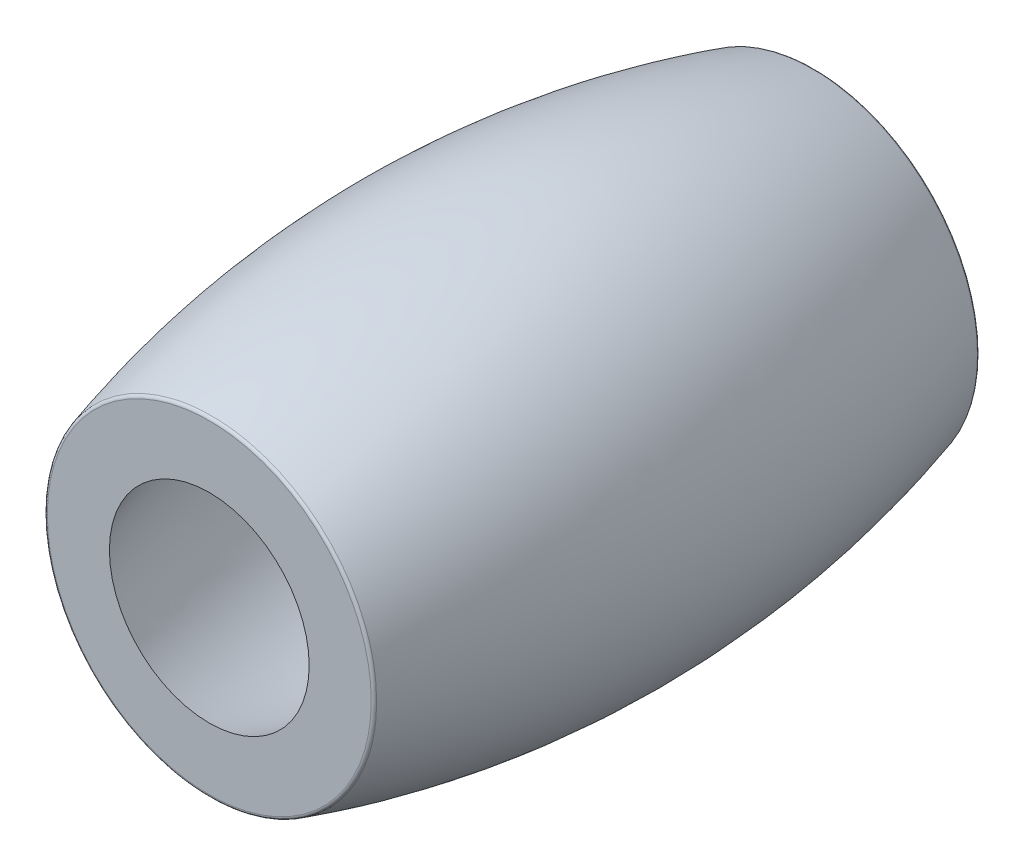
ISO-10303-21;
HEADER;
FILE_DESCRIPTION(('STEP AP214'),'2;1');
FILE_NAME('part.step','',(''),(''),'','','');
FILE_SCHEMA(('AUTOMOTIVE_DESIGN { 1 0 10303 214 1 1 1 1 }'));
ENDSEC;
DATA;
#1=APPLICATION_CONTEXT('core data for automotive mechanical design processes');
#2=APPLICATION_PROTOCOL_DEFINITION('international standard','automotive_design',2000,#1);
#3=PRODUCT_CONTEXT('',#1,'mechanical');
#4=PRODUCT('Part','Part','',(#3));
#5=PRODUCT_RELATED_PRODUCT_CATEGORY('part','',(#4));
#6=PRODUCT_DEFINITION_FORMATION('','',#4);
#7=PRODUCT_DEFINITION_CONTEXT('part definition',#1,'design');
#8=PRODUCT_DEFINITION('design','',#6,#7);
#9=PRODUCT_DEFINITION_SHAPE('','',#8);
#10=(LENGTH_UNIT() NAMED_UNIT(*) SI_UNIT(.MILLI.,.METRE.));
#11=(NAMED_UNIT(*) PLANE_ANGLE_UNIT() SI_UNIT($,.RADIAN.));
#12=(NAMED_UNIT(*) SI_UNIT($,.STERADIAN.) SOLID_ANGLE_UNIT());
#13=UNCERTAINTY_MEASURE_WITH_UNIT(LENGTH_MEASURE(1.E-05),#10,'distance_accuracy_value','');
#14=(GEOMETRIC_REPRESENTATION_CONTEXT(3) GLOBAL_UNCERTAINTY_ASSIGNED_CONTEXT((#13)) GLOBAL_UNIT_ASSIGNED_CONTEXT((#10,
#11,#12)) REPRESENTATION_CONTEXT('',''));
#15=CARTESIAN_POINT('',(0.,0.,0.));
#16=DIRECTION('',(0.,0.,1.));
#17=DIRECTION('',(1.,0.,0.));
#18=AXIS2_PLACEMENT_3D('',#15,#16,#17);
#19=CARTESIAN_POINT('',(-3.09369245283389,0.,-9.375));
#20=CARTESIAN_POINT('',(-3.09369245283389,-3.09369245283389,-9.375));
#21=CARTESIAN_POINT('',(0.,-3.09369245283389,-9.375));
#22=CARTESIAN_POINT('',(3.09369245283389,-3.09369245283389,-9.375));
#23=CARTESIAN_POINT('',(3.09369245283389,0.,-9.375));
#24=CARTESIAN_POINT('',(3.09369245283389,3.09369245283389,-9.375));
#25=CARTESIAN_POINT('',(0.,3.09369245283389,-9.375));
#26=CARTESIAN_POINT('',(-3.09369245283389,3.09369245283389,-9.375));
#27=CARTESIAN_POINT('',(-3.09369245283389,0.,-9.375));
#28=CARTESIAN_POINT('',(-5.97105346882137,0.,0.));
#29=CARTESIAN_POINT('',(-5.97105346882136,-5.97105346882136,0.));
#30=CARTESIAN_POINT('',(0.,-5.97105346882137,0.));
#31=CARTESIAN_POINT('',(5.97105346882136,-5.97105346882136,0.));
#32=CARTESIAN_POINT('',(5.97105346882137,0.,0.));
#33=CARTESIAN_POINT('',(5.97105346882136,5.97105346882136,0.));
#34=CARTESIAN_POINT('',(0.,5.97105346882137,0.));
#35=CARTESIAN_POINT('',(-5.97105346882136,5.97105346882136,0.));
#36=CARTESIAN_POINT('',(-5.97105346882137,0.,0.));
#37=CARTESIAN_POINT('',(-3.09369245283389,0.,9.375));
#38=CARTESIAN_POINT('',(-3.09369245283389,-3.09369245283389,9.375));
#39=CARTESIAN_POINT('',(0.,-3.09369245283389,9.375));
#40=CARTESIAN_POINT('',(3.09369245283389,-3.09369245283389,9.375));
#41=CARTESIAN_POINT('',(3.09369245283389,0.,9.375));
#42=CARTESIAN_POINT('',(3.09369245283389,3.09369245283389,9.375));
#43=CARTESIAN_POINT('',(0.,3.09369245283389,9.375));
#44=CARTESIAN_POINT('',(-3.09369245283389,3.09369245283389,9.375));
#45=CARTESIAN_POINT('',(-3.09369245283389,0.,9.375));
#46=(BOUNDED_SURFACE() B_SPLINE_SURFACE(2,2,((#19,#20,#21,#22,#23,#24,#25,#26,#27),(#28,#29,#30,
#31,#32,#33,#34,#35,#36),(#37,#38,#39,#40,#41,#42,#43,#44,#45)),.UNSPECIFIED.,.F.,.T.,
.F.) B_SPLINE_SURFACE_WITH_KNOTS((3,3),(3,2,2,2,3),(-0.297791901788887,0.297791901788887),
(-3.14159265358979,-1.5707963267949,0.,1.5707963267949,3.14159265358979),
.UNSPECIFIED.) GEOMETRIC_REPRESENTATION_ITEM() RATIONAL_B_SPLINE_SURFACE(((1.,0.707106781186548,
1.,0.707106781186548,1.,0.707106781186548,1.,0.707106781186548,1.),(0.955986697269997,
0.675984676363746,0.955986697269997,0.675984676363746,0.955986697269997,0.675984676363746,
0.955986697269997,0.675984676363746,0.955986697269997),(1.,0.707106781186548,1.,
0.707106781186548,1.,0.707106781186548,1.,0.707106781186548,1.))) REPRESENTATION_ITEM('') SURFACE());
#47=CARTESIAN_POINT('',(0.,0.,-9.375));
#48=DIRECTION('',(0.,0.,1.));
#49=DIRECTION('',(1.,0.,0.));
#50=AXIS2_PLACEMENT_3D('',#47,#48,#49);
#51=CIRCLE('',#50,3.09369245283389);
#52=CARTESIAN_POINT('',(-3.09369245283389,0.,-9.375));
#53=VERTEX_POINT('',#52);
#54=EDGE_CURVE('E62',#53,#53,#51,.T.);
#55=CARTESIAN_POINT('',(27.451875,0.,0.));
#56=DIRECTION('',(0.,1.,0.));
#57=DIRECTION('',(-1.,0.,0.));
#58=AXIS2_PLACEMENT_3D('',#55,#56,#57);
#59=CIRCLE('',#58,31.951875);
#60=CARTESIAN_POINT('',(-3.09369245283389,0.,9.375));
#61=VERTEX_POINT('',#60);
#62=EDGE_CURVE('E11',#53,#61,#59,.T.);
#63=CARTESIAN_POINT('',(0.,0.,9.375));
#64=DIRECTION('',(0.,0.,-1.));
#65=DIRECTION('',(1.,0.,0.));
#66=AXIS2_PLACEMENT_3D('',#63,#64,#65);
#67=CIRCLE('',#66,3.09369245283389);
#68=EDGE_CURVE('E30',#61,#61,#67,.T.);
#69=ORIENTED_EDGE('',*,*,#54,.F.);
#70=ORIENTED_EDGE('',*,*,#62,.T.);
#71=ORIENTED_EDGE('',*,*,#68,.F.);
#72=ORIENTED_EDGE('',*,*,#62,.F.);
#73=EDGE_LOOP('',(#69,#70,#71,#72));
#74=FACE_BOUND('',#73,.T.);
#75=ADVANCED_FACE('F17',(#74),#46,.T.);
#76=CARTESIAN_POINT('',(0.,0.,9.375));
#77=DIRECTION('',(0.,0.,1.));
#78=DIRECTION('',(1.,0.,0.));
#79=AXIS2_PLACEMENT_3D('',#76,#77,#78);
#80=PLANE('',#79);
#81=ORIENTED_EDGE('',*,*,#68,.T.);
#82=EDGE_LOOP('',(#81));
#83=FACE_BOUND('',#82,.T.);
#84=CARTESIAN_POINT('',(0.,0.,9.375));
#85=DIRECTION('',(0.,0.,-1.));
#86=DIRECTION('',(0.,-1.,0.));
#87=AXIS2_PLACEMENT_3D('',#84,#85,#86);
#88=CIRCLE('',#87,5.01567521565018);
#89=CARTESIAN_POINT('',(-5.01567521565018,0.,9.375));
#90=VERTEX_POINT('',#89);
#91=EDGE_CURVE('E67',#90,#90,#88,.T.);
#92=ORIENTED_EDGE('',*,*,#91,.F.);
#93=EDGE_LOOP('',(#92));
#94=FACE_BOUND('',#93,.T.);
#95=ADVANCED_FACE('F118',(#83,#94),#80,.T.);
#96=CARTESIAN_POINT('',(0.,0.,9.275));
#97=DIRECTION('',(0.,0.,1.));
#98=DIRECTION('',(1.,0.,0.));
#99=AXIS2_PLACEMENT_3D('',#96,#97,#98);
#100=TOROIDAL_SURFACE('',#99,5.01567521565018,0.1);
#101=ORIENTED_EDGE('',*,*,#91,.T.);
#102=CARTESIAN_POINT('',(-5.01567521565018,0.,9.275));
#103=DIRECTION('',(0.,-1.,0.));
#104=DIRECTION('',(-1.,0.,0.));
#105=AXIS2_PLACEMENT_3D('',#102,#103,#104);
#106=CIRCLE('',#105,0.1);
#107=CARTESIAN_POINT('',(-5.11161986256647,0.,9.30318908881305));
#108=VERTEX_POINT('',#107);
#109=EDGE_CURVE('E76',#90,#108,#106,.T.);
#110=ORIENTED_EDGE('',*,*,#109,.T.);
#111=CARTESIAN_POINT('',(0.,0.,9.30318908881305));
#112=DIRECTION('',(0.,0.,1.));
#113=DIRECTION('',(0.,-1.,0.));
#114=AXIS2_PLACEMENT_3D('',#111,#112,#113);
#115=CIRCLE('',#114,5.11161986256647);
#116=EDGE_CURVE('E68',#108,#108,#115,.T.);
#117=ORIENTED_EDGE('',*,*,#116,.T.);
#118=ORIENTED_EDGE('',*,*,#109,.F.);
#119=EDGE_LOOP('',(#101,#110,#117,#118));
#120=FACE_BOUND('',#119,.T.);
#121=ADVANCED_FACE('F121',(#120),#100,.T.);
#122=CARTESIAN_POINT('',(0.,0.,-9.375));
#123=DIRECTION('',(0.,0.,1.));
#124=DIRECTION('',(1.,0.,0.));
#125=AXIS2_PLACEMENT_3D('',#122,#123,#124);
#126=PLANE('',#125);
#127=ORIENTED_EDGE('',*,*,#54,.T.);
#128=EDGE_LOOP('',(#127));
#129=FACE_BOUND('',#128,.T.);
#130=CARTESIAN_POINT('',(0.,0.,-9.375));
#131=DIRECTION('',(0.,0.,1.));
#132=DIRECTION('',(0.,-1.,0.));
#133=AXIS2_PLACEMENT_3D('',#130,#131,#132);
#134=CIRCLE('',#133,5.01567521565018);
#135=CARTESIAN_POINT('',(5.01567521565018,0.,-9.375));
#136=VERTEX_POINT('',#135);
#137=EDGE_CURVE('E107',#136,#136,#134,.T.);
#138=ORIENTED_EDGE('',*,*,#137,.F.);
#139=EDGE_LOOP('',(#138));
#140=FACE_BOUND('',#139,.T.);
#141=ADVANCED_FACE('F64',(#129,#140),#126,.F.);
#142=CARTESIAN_POINT('',(-5.11161986256647,0.,-9.30318908881305));
#143=CARTESIAN_POINT('',(-5.11161986256646,-5.11161986256646,-9.30318908881305));
#144=CARTESIAN_POINT('',(0.,-5.11161986256647,-9.30318908881305));
#145=CARTESIAN_POINT('',(5.11161986256646,-5.11161986256646,-9.30318908881305));
#146=CARTESIAN_POINT('',(5.11161986256647,0.,-9.30318908881305));
#147=CARTESIAN_POINT('',(5.11161986256646,5.11161986256646,-9.30318908881305));
#148=CARTESIAN_POINT('',(0.,5.11161986256647,-9.30318908881305));
#149=CARTESIAN_POINT('',(-5.11161986256646,5.11161986256646,-9.30318908881305));
#150=CARTESIAN_POINT('',(-5.11161986256647,0.,-9.30318908881305));
#151=CARTESIAN_POINT('',(-7.84495029733277,0.,0.));
#152=CARTESIAN_POINT('',(-7.84495029733277,-7.84495029733277,0.));
#153=CARTESIAN_POINT('',(0.,-7.84495029733277,0.));
#154=CARTESIAN_POINT('',(7.84495029733277,-7.84495029733277,0.));
#155=CARTESIAN_POINT('',(7.84495029733277,0.,0.));
#156=CARTESIAN_POINT('',(7.84495029733277,7.84495029733277,0.));
#157=CARTESIAN_POINT('',(0.,7.84495029733277,0.));
#158=CARTESIAN_POINT('',(-7.84495029733277,7.84495029733277,0.));
#159=CARTESIAN_POINT('',(-7.84495029733277,0.,0.));
#160=CARTESIAN_POINT('',(-5.11161986256647,0.,9.30318908881305));
#161=CARTESIAN_POINT('',(-5.11161986256646,-5.11161986256646,9.30318908881305));
#162=CARTESIAN_POINT('',(0.,-5.11161986256647,9.30318908881305));
#163=CARTESIAN_POINT('',(5.11161986256646,-5.11161986256646,9.30318908881305));
#164=CARTESIAN_POINT('',(5.11161986256647,0.,9.30318908881305));
#165=CARTESIAN_POINT('',(5.11161986256646,5.11161986256646,9.30318908881305));
#166=CARTESIAN_POINT('',(0.,5.11161986256647,9.30318908881305));
#167=CARTESIAN_POINT('',(-5.11161986256646,5.11161986256646,9.30318908881305));
#168=CARTESIAN_POINT('',(-5.11161986256647,0.,9.30318908881305));
#169=(BOUNDED_SURFACE() B_SPLINE_SURFACE(2,2,((#142,#143,#144,#145,#146,#147,#148,#149,#150),
(#151,#152,#153,#154,#155,#156,#157,#158,#159),(#160,#161,#162,#163,#164,#165,#166,#167,#168)),
.UNSPECIFIED.,.F.,.T.,.F.) B_SPLINE_SURFACE_WITH_KNOTS((3,3),(3,2,2,2,3),(-0.28576435172275,
0.28576435172275),(-3.14159265358979,-1.5707963267949,0.,1.5707963267949,3.14159265358979),
.UNSPECIFIED.) GEOMETRIC_REPRESENTATION_ITEM() RATIONAL_B_SPLINE_SURFACE(((1.,0.707106781186548,
1.,0.707106781186548,1.,0.707106781186548,1.,0.707106781186548,1.),(0.959446469162809,
0.678431104530512,0.959446469162809,0.678431104530512,0.959446469162809,0.678431104530512,
0.959446469162809,0.678431104530512,0.959446469162809),(1.,0.707106781186548,1.,
0.707106781186548,1.,0.707106781186548,1.,0.707106781186548,1.))) REPRESENTATION_ITEM('') SURFACE());
#170=CARTESIAN_POINT('',(0.,0.,-9.30318908881305));
#171=DIRECTION('',(0.,0.,-1.));
#172=DIRECTION('',(0.,-1.,0.));
#173=AXIS2_PLACEMENT_3D('',#170,#171,#172);
#174=CIRCLE('',#173,5.11161986256647);
#175=CARTESIAN_POINT('',(-5.11161986256647,0.,-9.30318908881305));
#176=VERTEX_POINT('',#175);
#177=CARTESIAN_POINT('',(5.11161986256647,0.,-9.30318908881305));
#178=VERTEX_POINT('',#177);
#179=EDGE_CURVE('E23',#176,#178,#174,.T.);
#180=CARTESIAN_POINT('',(26.5528017241379,0.,0.));
#181=DIRECTION('',(0.,1.,0.));
#182=DIRECTION('',(-1.,0.,0.));
#183=AXIS2_PLACEMENT_3D('',#180,#181,#182);
#184=CIRCLE('',#183,33.0028017241379);
#185=EDGE_CURVE('E79',#176,#108,#184,.T.);
#186=CARTESIAN_POINT('',(0.,0.,-9.30318908881305));
#187=DIRECTION('',(0.,0.,-1.));
#188=DIRECTION('',(0.,-1.,0.));
#189=AXIS2_PLACEMENT_3D('',#186,#187,#188);
#190=CIRCLE('',#189,5.11161986256647);
#191=EDGE_CURVE('E83',#178,#176,#190,.T.);
#192=ORIENTED_EDGE('',*,*,#179,.F.);
#193=ORIENTED_EDGE('',*,*,#185,.T.);
#194=ORIENTED_EDGE('',*,*,#116,.F.);
#195=ORIENTED_EDGE('',*,*,#185,.F.);
#196=ORIENTED_EDGE('',*,*,#191,.F.);
#197=EDGE_LOOP('',(#192,#193,#194,#195,#196));
#198=FACE_BOUND('',#197,.T.);
#199=ADVANCED_FACE('F19',(#198),#169,.F.);
#200=CARTESIAN_POINT('',(0.,0.,-9.275));
#201=DIRECTION('',(0.,0.,-1.));
#202=DIRECTION('',(-1.,0.,0.));
#203=AXIS2_PLACEMENT_3D('',#200,#201,#202);
#204=TOROIDAL_SURFACE('',#203,5.01567521565018,0.1);
#205=ORIENTED_EDGE('',*,*,#137,.T.);
#206=CARTESIAN_POINT('',(5.01567521565018,0.,-9.275));
#207=DIRECTION('',(0.,-1.,0.));
#208=DIRECTION('',(1.,0.,0.));
#209=AXIS2_PLACEMENT_3D('',#206,#207,#208);
#210=CIRCLE('',#209,0.1);
#211=EDGE_CURVE('E102',#136,#178,#210,.T.);
#212=ORIENTED_EDGE('',*,*,#211,.T.);
#213=ORIENTED_EDGE('',*,*,#191,.T.);
#214=ORIENTED_EDGE('',*,*,#179,.T.);
#215=ORIENTED_EDGE('',*,*,#211,.F.);
#216=EDGE_LOOP('',(#205,#212,#213,#214,#215));
#217=FACE_BOUND('',#216,.T.);
#218=ADVANCED_FACE('F172',(#217),#204,.T.);
#219=CLOSED_SHELL('',(#75,#95,#121,#141,#199,#218));
#220=MANIFOLD_SOLID_BREP('B1',#219);
#221=ADVANCED_BREP_SHAPE_REPRESENTATION('',(#18,#220),#14);
#222=SHAPE_DEFINITION_REPRESENTATION(#9,#221);
ENDSEC;
END-ISO-10303-21;
